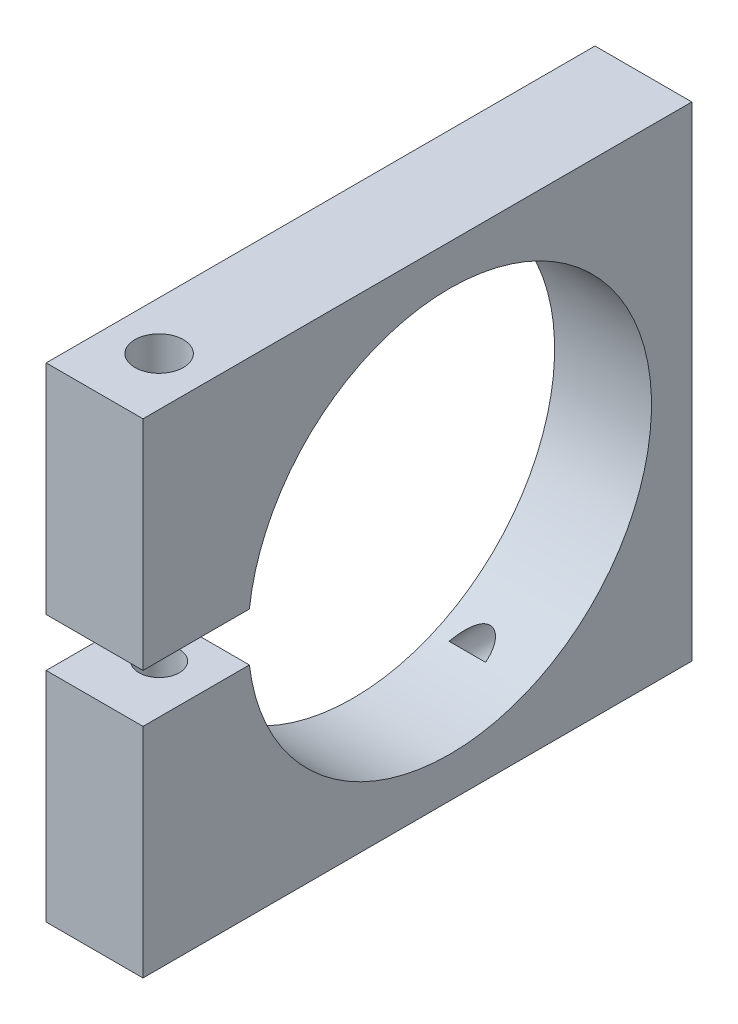
ISO-10303-21;
HEADER;
FILE_DESCRIPTION(('STEP AP214'),'2;1');
FILE_NAME('part.step','',(''),(''),'','','');
FILE_SCHEMA(('AUTOMOTIVE_DESIGN { 1 0 10303 214 1 1 1 1 }'));
ENDSEC;
DATA;
#1=APPLICATION_CONTEXT('core data for automotive mechanical design processes');
#2=APPLICATION_PROTOCOL_DEFINITION('international standard','automotive_design',2000,#1);
#3=PRODUCT_CONTEXT('',#1,'mechanical');
#4=PRODUCT('Part','Part','',(#3));
#5=PRODUCT_RELATED_PRODUCT_CATEGORY('part','',(#4));
#6=PRODUCT_DEFINITION_FORMATION('','',#4);
#7=PRODUCT_DEFINITION_CONTEXT('part definition',#1,'design');
#8=PRODUCT_DEFINITION('design','',#6,#7);
#9=PRODUCT_DEFINITION_SHAPE('','',#8);
#10=(LENGTH_UNIT() NAMED_UNIT(*) SI_UNIT(.MILLI.,.METRE.));
#11=(NAMED_UNIT(*) PLANE_ANGLE_UNIT() SI_UNIT($,.RADIAN.));
#12=(NAMED_UNIT(*) SI_UNIT($,.STERADIAN.) SOLID_ANGLE_UNIT());
#13=UNCERTAINTY_MEASURE_WITH_UNIT(LENGTH_MEASURE(1.E-05),#10,'distance_accuracy_value','');
#14=(GEOMETRIC_REPRESENTATION_CONTEXT(3) GLOBAL_UNCERTAINTY_ASSIGNED_CONTEXT((#13)) GLOBAL_UNIT_ASSIGNED_CONTEXT((#10,
#11,#12)) REPRESENTATION_CONTEXT('',''));
#15=CARTESIAN_POINT('',(0.,0.,0.));
#16=DIRECTION('',(0.,0.,1.));
#17=DIRECTION('',(1.,0.,0.));
#18=AXIS2_PLACEMENT_3D('',#15,#16,#17);
#19=CARTESIAN_POINT('',(276.,679.332012286218,-391.357743681072));
#20=DIRECTION('',(0.,0.,1.));
#21=DIRECTION('',(1.,0.,0.));
#22=AXIS2_PLACEMENT_3D('',#19,#20,#21);
#23=PLANE('',#22);
#24=DIRECTION('',(1.,0.,0.));
#25=VECTOR('',#24,1.);
#26=CARTESIAN_POINT('',(276.,678.788451523607,-391.357743681072));
#27=LINE('',#26,#25);
#28=CARTESIAN_POINT('',(277.125629467165,678.788451523608,-391.357743681072));
#29=VERTEX_POINT('',#28);
#30=CARTESIAN_POINT('',(274.874370532835,678.788451523608,-391.357743681072));
#31=VERTEX_POINT('',#30);
#32=EDGE_CURVE('E91',#29,#31,#27,.F.);
#33=ORIENTED_EDGE('',*,*,#32,.T.);
#34=CARTESIAN_POINT('',(276.,679.332012286218,-391.357743681072));
#35=DIRECTION('',(0.,0.,1.));
#36=DIRECTION('',(1.,0.,0.));
#37=AXIS2_PLACEMENT_3D('',#34,#35,#36);
#38=CIRCLE('',#37,1.25);
#39=EDGE_CURVE('E20',#31,#29,#38,.F.);
#40=ORIENTED_EDGE('',*,*,#39,.T.);
#41=EDGE_LOOP('',(#33,#40));
#42=FACE_BOUND('',#41,.T.);
#43=ADVANCED_FACE('F17',(#42),#23,.F.);
#44=CARTESIAN_POINT('',(275.09203088991,655.349193600852,-391.357743681072));
#45=DIRECTION('',(0.,0.,1.));
#46=DIRECTION('',(1.,0.,0.));
#47=AXIS2_PLACEMENT_3D('',#44,#45,#46);
#48=PLANE('',#47);
#49=CARTESIAN_POINT('',(275.09203088991,655.349193600852,-391.357743681072));
#50=DIRECTION('',(0.,0.,1.));
#51=DIRECTION('',(1.,0.,0.));
#52=AXIS2_PLACEMENT_3D('',#49,#50,#51);
#53=CIRCLE('',#52,1.25);
#54=CARTESIAN_POINT('',(276.225796596195,655.875573048828,-391.357743681072));
#55=VERTEX_POINT('',#54);
#56=CARTESIAN_POINT('',(273.958265183625,655.875573048828,-391.357743681072));
#57=VERTEX_POINT('',#56);
#58=EDGE_CURVE('E100',#55,#57,#53,.F.);
#59=ORIENTED_EDGE('',*,*,#58,.T.);
#60=DIRECTION('',(1.,0.,0.));
#61=VECTOR('',#60,1.);
#62=CARTESIAN_POINT('',(276.,655.875573048828,-391.357743681072));
#63=LINE('',#62,#61);
#64=EDGE_CURVE('E103',#57,#55,#63,.T.);
#65=ORIENTED_EDGE('',*,*,#64,.T.);
#66=EDGE_LOOP('',(#59,#65));
#67=FACE_BOUND('',#66,.T.);
#68=ADVANCED_FACE('F317',(#67),#48,.F.);
#69=CARTESIAN_POINT('',(276.,675.582012286218,-371.357743681072));
#70=DIRECTION('',(0.,-1.,0.));
#71=DIRECTION('',(1.,0.,0.));
#72=AXIS2_PLACEMENT_3D('',#69,#70,#71);
#73=CYLINDRICAL_SURFACE('',#72,1.5);
#74=CARTESIAN_POINT('',(276.,668.832012286218,-371.357743681072));
#75=DIRECTION('',(0.,-1.,0.));
#76=DIRECTION('',(1.,0.,0.));
#77=AXIS2_PLACEMENT_3D('',#74,#75,#76);
#78=CIRCLE('',#77,1.5);
#79=CARTESIAN_POINT('',(277.5,668.832012286218,-371.357743681072));
#80=VERTEX_POINT('',#79);
#81=EDGE_CURVE('E144',#80,#80,#78,.F.);
#82=ORIENTED_EDGE('',*,*,#81,.F.);
#83=EDGE_LOOP('',(#82));
#84=FACE_BOUND('',#83,.T.);
#85=CARTESIAN_POINT('',(276.,682.332012286218,-371.357743681072));
#86=DIRECTION('',(0.,-1.,0.));
#87=DIRECTION('',(1.,0.,0.));
#88=AXIS2_PLACEMENT_3D('',#85,#86,#87);
#89=CIRCLE('',#88,1.5);
#90=CARTESIAN_POINT('',(277.5,682.332012286218,-371.357743681072));
#91=VERTEX_POINT('',#90);
#92=EDGE_CURVE('E166',#91,#91,#89,.F.);
#93=ORIENTED_EDGE('',*,*,#92,.T.);
#94=EDGE_LOOP('',(#93));
#95=FACE_BOUND('',#94,.T.);
#96=ADVANCED_FACE('F314',(#84,#95),#73,.F.);
#97=CARTESIAN_POINT('',(276.,679.332012286218,-396.357743681072));
#98=DIRECTION('',(0.,0.,1.));
#99=DIRECTION('',(1.,0.,0.));
#100=AXIS2_PLACEMENT_3D('',#97,#98,#99);
#101=CYLINDRICAL_SURFACE('',#100,1.25);
#102=ORIENTED_EDGE('',*,*,#39,.F.);
#103=CARTESIAN_POINT('',(274.874370532835,678.788451523607,-391.357743681072));
#104=CARTESIAN_POINT('',(274.888547311662,678.759158530851,-391.424874986713));
#105=CARTESIAN_POINT('',(274.904313848297,678.729372421661,-391.491501734669));
#106=CARTESIAN_POINT('',(274.9397679739,678.668944062371,-391.623599616107));
#107=CARTESIAN_POINT('',(274.959469099715,678.638299179585,-391.689065886078));
#108=CARTESIAN_POINT('',(275.003676057281,678.576166002763,-391.81890168151));
#109=CARTESIAN_POINT('',(275.028230354256,678.544672223009,-391.883252367618));
#110=CARTESIAN_POINT('',(275.082904318561,678.481613735001,-392.009411103043));
#111=CARTESIAN_POINT('',(275.113015326515,678.450049211576,-392.07122292807));
#112=CARTESIAN_POINT('',(275.176377528957,678.390833126092,-392.184933084611));
#113=CARTESIAN_POINT('',(275.208939854464,678.363126685746,-392.237181628786));
#114=CARTESIAN_POINT('',(275.280483611646,678.308874158125,-392.337858019734));
#115=CARTESIAN_POINT('',(275.319466449945,678.282328326737,-392.386285025827));
#116=CARTESIAN_POINT('',(275.405645974502,678.231193381973,-392.478254782907));
#117=CARTESIAN_POINT('',(275.452962380708,678.206641680737,-392.521708573744));
#118=CARTESIAN_POINT('',(275.556312758383,678.162069280487,-392.599688219837));
#119=CARTESIAN_POINT('',(275.612305184547,678.142028049982,-392.634254636942));
#120=CARTESIAN_POINT('',(275.706730571812,678.116379441297,-392.678169033972));
#121=CARTESIAN_POINT('',(275.742413610677,678.108266366053,-392.691977271443));
#122=CARTESIAN_POINT('',(275.815898753795,678.09508511055,-392.714349171645));
#123=CARTESIAN_POINT('',(275.853695430248,678.090009490308,-392.722925650124));
#124=CARTESIAN_POINT('',(275.90986700991,678.085136691964,-392.731151203177));
#125=CARTESIAN_POINT('',(275.927811806635,678.083968334202,-392.733121607686));
#126=CARTESIAN_POINT('',(275.963834554638,678.082405444177,-392.735756622392));
#127=CARTESIAN_POINT('',(275.981912534552,678.082011083516,-392.736420943019));
#128=CARTESIAN_POINT('',(276.037919978754,678.082014807657,-392.736415211869));
#129=CARTESIAN_POINT('',(276.075881648531,678.083755917596,-392.733483360501));
#130=CARTESIAN_POINT('',(276.1506640448,678.090554399809,-392.722004282596));
#131=CARTESIAN_POINT('',(276.187482616641,678.095617678574,-392.713447054638));
#132=CARTESIAN_POINT('',(276.258799309285,678.108562896897,-392.691472107619));
#133=CARTESIAN_POINT('',(276.293311748135,678.116425051147,-392.678088497932));
#134=CARTESIAN_POINT('',(276.359808003671,678.134420168054,-392.64728285928));
#135=CARTESIAN_POINT('',(276.391791566937,678.144553357903,-392.629860426269));
#136=CARTESIAN_POINT('',(276.473431946554,678.17386746781,-392.579118213456));
#137=CARTESIAN_POINT('',(276.52074143226,678.194591782749,-392.542918519009));
#138=CARTESIAN_POINT('',(276.608389782036,678.238947914011,-392.464363314685));
#139=CARTESIAN_POINT('',(276.648706863418,678.26258843691,-392.421989299127));
#140=CARTESIAN_POINT('',(276.717943107232,678.308039807981,-392.339275940135));
#141=CARTESIAN_POINT('',(276.747667781704,678.329642601314,-392.299484027972));
#142=CARTESIAN_POINT('',(276.803143848716,678.373519078256,-392.217547113976));
#143=CARTESIAN_POINT('',(276.828892068646,678.395793280787,-392.175400269396));
#144=CARTESIAN_POINT('',(276.901096409584,678.463167645459,-392.046047910081));
#145=CARTESIAN_POINT('',(276.942337299412,678.50869602627,-391.956153765723));
#146=CARTESIAN_POINT('',(277.010295021336,678.594152717142,-391.782004780799));
#147=CARTESIAN_POINT('',(277.038098936915,678.634155153897,-391.69818824205));
#148=CARTESIAN_POINT('',(277.074585053104,678.693036947295,-391.571117453222));
#149=CARTESIAN_POINT('',(277.085826066564,678.712366875094,-391.528788775998));
#150=CARTESIAN_POINT('',(277.106809552187,678.750679327403,-391.443628570796));
#151=CARTESIAN_POINT('',(277.116552682619,678.769662001269,-391.400797272662));
#152=CARTESIAN_POINT('',(277.125629467165,678.788451523607,-391.357743681072));
#153=B_SPLINE_CURVE_WITH_KNOTS('',3,(#103,#104,#105,#106,#107,#108,#109,#110,#111,#112,#113,
#114,#115,#116,#117,#118,#119,#120,#121,#122,#123,#124,#125,#126,#127,#128,#129,#130,#131,#132,
#133,#134,#135,#136,#137,#138,#139,#140,#141,#142,#143,#144,#145,#146,#147,#148,#149,#150,#151,
#152),.UNSPECIFIED.,.F.,.F.,(4,2,2,2,2,2,2,2,2,2,2,2,2,2,2,2,2,2,2,2,2,2,2,2,4),(0.,
0.223852835243964,0.448489525676321,0.675494513856815,0.902148688066082,1.10435915089784,
1.30661397366381,1.51205494754333,1.71654094559981,1.83345002557234,1.95007156215759,
2.00428725628167,2.05851496910071,2.17220219210391,2.28609208955678,2.39919238207929,
2.51230399409326,2.70043472714962,2.88914138900703,3.05139545995385,3.2137783236471,
3.53946222024909,3.83000013337773,3.97359127374062,4.11711912909475),.UNSPECIFIED.);
#154=EDGE_CURVE('E98',#31,#29,#153,.T.);
#155=ORIENTED_EDGE('',*,*,#154,.T.);
#156=EDGE_LOOP('',(#102,#155));
#157=FACE_BOUND('',#156,.T.);
#158=CARTESIAN_POINT('',(276.,679.332012286218,-401.357743681072));
#159=DIRECTION('',(0.,0.,1.));
#160=DIRECTION('',(1.,0.,0.));
#161=AXIS2_PLACEMENT_3D('',#158,#159,#160);
#162=CIRCLE('',#161,1.25);
#163=CARTESIAN_POINT('',(277.25,679.332012286218,-401.357743681072));
#164=VERTEX_POINT('',#163);
#165=EDGE_CURVE('E131',#164,#164,#162,.F.);
#166=ORIENTED_EDGE('',*,*,#165,.T.);
#167=EDGE_LOOP('',(#166));
#168=FACE_BOUND('',#167,.T.);
#169=ADVANCED_FACE('F96',(#157,#168),#101,.F.);
#170=CARTESIAN_POINT('',(275.09203088991,655.349193600852,-396.357743681072));
#171=DIRECTION('',(0.,0.,1.));
#172=DIRECTION('',(1.,0.,0.));
#173=AXIS2_PLACEMENT_3D('',#170,#171,#172);
#174=CYLINDRICAL_SURFACE('',#173,1.25);
#175=ORIENTED_EDGE('',*,*,#58,.F.);
#176=CARTESIAN_POINT('',(276.225796596195,655.875573048828,-391.357743681072));
#177=CARTESIAN_POINT('',(276.211912813258,655.905408764792,-391.426118824964));
#178=CARTESIAN_POINT('',(276.19641597643,655.935763137653,-391.493987142951));
#179=CARTESIAN_POINT('',(276.161439417601,655.997379700106,-391.628565866877));
#180=CARTESIAN_POINT('',(276.141945940009,656.028644696172,-391.69527138649));
#181=CARTESIAN_POINT('',(276.098079753026,656.092068931824,-391.827580703306));
#182=CARTESIAN_POINT('',(276.073658397096,656.124234090516,-391.893165821639));
#183=CARTESIAN_POINT('',(276.019147353394,656.188679805774,-392.021779187281));
#184=CARTESIAN_POINT('',(275.989066491429,656.220960106899,-392.084811232477));
#185=CARTESIAN_POINT('',(275.92576068952,656.281444251563,-392.200578846786));
#186=CARTESIAN_POINT('',(275.893261425385,656.309700942321,-392.253678407755));
#187=CARTESIAN_POINT('',(275.821762767232,656.365085533453,-392.35606840696));
#188=CARTESIAN_POINT('',(275.782761699795,656.392213140974,-392.405357859766));
#189=CARTESIAN_POINT('',(275.696439599449,656.444541318179,-392.499070386438));
#190=CARTESIAN_POINT('',(275.648998032922,656.469705133101,-392.543405339136));
#191=CARTESIAN_POINT('',(275.545230227124,656.515506068184,-392.623148278188));
#192=CARTESIAN_POINT('',(275.488946417484,656.536163734838,-392.658596898557));
#193=CARTESIAN_POINT('',(275.39402863583,656.562691833257,-392.703774571339));
#194=CARTESIAN_POINT('',(275.358241131438,656.571098349421,-392.718004066657));
#195=CARTESIAN_POINT('',(275.28446946044,656.584857023709,-392.741225264732));
#196=CARTESIAN_POINT('',(275.246490740355,656.590216423643,-392.750229387232));
#197=CARTESIAN_POINT('',(275.188807203642,656.595590549123,-392.759248121985));
#198=CARTESIAN_POINT('',(275.169551760163,656.596937580101,-392.761506200024));
#199=CARTESIAN_POINT('',(275.130877922597,656.598739855288,-392.764526474793));
#200=CARTESIAN_POINT('',(275.11145949315,656.599194900687,-392.765288338038));
#201=CARTESIAN_POINT('',(275.053952781713,656.599191053305,-392.765282456632));
#202=CARTESIAN_POINT('',(275.01583559388,656.597435589829,-392.762344456205));
#203=CARTESIAN_POINT('',(274.940748346093,656.590580872133,-392.750840965678));
#204=CARTESIAN_POINT('',(274.903780322562,656.585476000942,-392.742266022354));
#205=CARTESIAN_POINT('',(274.832171563862,656.572422853354,-392.720242820909));
#206=CARTESIAN_POINT('',(274.797516579527,656.564494360849,-392.706828462186));
#207=CARTESIAN_POINT('',(274.730745463255,656.546345266518,-392.675948220418));
#208=CARTESIAN_POINT('',(274.698629652353,656.536124375483,-392.658481826159));
#209=CARTESIAN_POINT('',(274.616730699125,656.5065809159,-392.607653095011));
#210=CARTESIAN_POINT('',(274.569296108306,656.485706897347,-392.571413403411));
#211=CARTESIAN_POINT('',(274.481421399781,656.441027414135,-392.492766690766));
#212=CARTESIAN_POINT('',(274.441002877616,656.417213271627,-392.450341342547));
#213=CARTESIAN_POINT('',(274.371669416427,656.37146877818,-392.367601976533));
#214=CARTESIAN_POINT('',(274.341935967918,656.349751070698,-392.327843519814));
#215=CARTESIAN_POINT('',(274.286445499192,656.305638625225,-392.245973863276));
#216=CARTESIAN_POINT('',(274.260691632952,656.283243366886,-392.203860832995));
#217=CARTESIAN_POINT('',(274.188472087447,656.215490945097,-392.074595294413));
#218=CARTESIAN_POINT('',(274.147233120059,656.169698171114,-391.98475164175));
#219=CARTESIAN_POINT('',(274.07752013815,656.081468303455,-391.806105751061));
#220=CARTESIAN_POINT('',(274.048443182376,656.038990947805,-391.717546878827));
#221=CARTESIAN_POINT('',(274.010595901181,655.976551287971,-391.583249074795));
#222=CARTESIAN_POINT('',(273.998996144469,655.956074291252,-391.53852252198));
#223=CARTESIAN_POINT('',(273.977443911473,655.915516356756,-391.448525373925));
#224=CARTESIAN_POINT('',(273.967490563033,655.89543521428,-391.403255080442));
#225=CARTESIAN_POINT('',(273.958265183625,655.875573048828,-391.357743681072));
#226=B_SPLINE_CURVE_WITH_KNOTS('',3,(#176,#177,#178,#179,#180,#181,#182,#183,#184,#185,#186,
#187,#188,#189,#190,#191,#192,#193,#194,#195,#196,#197,#198,#199,#200,#201,#202,#203,#204,#205,
#206,#207,#208,#209,#210,#211,#212,#213,#214,#215,#216,#217,#218,#219,#220,#221,#222,#223,#224,
#225),.UNSPECIFIED.,.F.,.F.,(4,2,2,2,2,2,2,2,2,2,2,2,2,2,2,2,2,2,2,2,2,2,2,2,4),(0.,
0.227689463136876,0.456176152549546,0.687039662433459,0.917546088668923,1.12232442490628,
1.32715554809219,1.53518877012573,1.74225262794148,1.86008396629231,1.97763408205646,
2.03586724255388,2.09411338088751,2.2082699535497,2.32261845828007,2.43618104480827,
2.54975796643882,2.73838441850979,2.92758154860538,3.0899144897238,3.25237543350026,
3.57826663381338,3.88520294132584,4.03679663083097,4.18830975723184),.UNSPECIFIED.);
#227=EDGE_CURVE('E150',#55,#57,#226,.T.);
#228=ORIENTED_EDGE('',*,*,#227,.T.);
#229=EDGE_LOOP('',(#175,#228));
#230=FACE_BOUND('',#229,.T.);
#231=CARTESIAN_POINT('',(275.09203088991,655.349193600852,-401.357743681072));
#232=DIRECTION('',(0.,0.,1.));
#233=DIRECTION('',(1.,0.,0.));
#234=AXIS2_PLACEMENT_3D('',#231,#232,#233);
#235=CIRCLE('',#234,1.25);
#236=CARTESIAN_POINT('',(276.34203088991,655.349193600852,-401.357743681072));
#237=VERTEX_POINT('',#236);
#238=EDGE_CURVE('E161',#237,#237,#235,.F.);
#239=ORIENTED_EDGE('',*,*,#238,.T.);
#240=EDGE_LOOP('',(#239));
#241=FACE_BOUND('',#240,.T.);
#242=ADVANCED_FACE('F183',(#230,#241),#174,.F.);
#243=CARTESIAN_POINT('',(273.,652.332012286218,-367.357743681072));
#244=DIRECTION('',(-1.,0.,0.));
#245=DIRECTION('',(0.,0.,1.));
#246=AXIS2_PLACEMENT_3D('',#243,#244,#245);
#247=PLANE('',#246);
#248=DIRECTION('',(0.,0.,1.));
#249=VECTOR('',#248,1.);
#250=CARTESIAN_POINT('',(273.,652.332012286218,-367.357743681072));
#251=LINE('',#250,#249);
#252=CARTESIAN_POINT('',(273.,652.332012286218,-401.357743681072));
#253=VERTEX_POINT('',#252);
#254=CARTESIAN_POINT('',(273.,652.332012286218,-367.357743681072));
#255=VERTEX_POINT('',#254);
#256=EDGE_CURVE('E123',#253,#255,#251,.T.);
#257=ORIENTED_EDGE('',*,*,#256,.T.);
#258=DIRECTION('',(0.,1.,0.));
#259=VECTOR('',#258,1.);
#260=CARTESIAN_POINT('',(273.,665.832012286218,-367.357743681072));
#261=LINE('',#260,#259);
#262=CARTESIAN_POINT('',(273.,665.832012286218,-367.357743681072));
#263=VERTEX_POINT('',#262);
#264=EDGE_CURVE('E118',#255,#263,#261,.T.);
#265=ORIENTED_EDGE('',*,*,#264,.T.);
#266=DIRECTION('',(0.,0.,1.));
#267=VECTOR('',#266,1.);
#268=CARTESIAN_POINT('',(273.,665.832012286218,-369.857743681072));
#269=LINE('',#268,#267);
#270=CARTESIAN_POINT('',(273.,665.832012286218,-373.948070035081));
#271=VERTEX_POINT('',#270);
#272=EDGE_CURVE('E112',#271,#263,#269,.T.);
#273=ORIENTED_EDGE('',*,*,#272,.F.);
#274=CARTESIAN_POINT('',(273.,667.332012286218,-386.357743681072));
#275=DIRECTION('',(1.,0.,0.));
#276=DIRECTION('',(0.,0.,-1.));
#277=AXIS2_PLACEMENT_3D('',#274,#275,#276);
#278=CIRCLE('',#277,12.5);
#279=CARTESIAN_POINT('',(273.,668.832012286218,-373.948070035081));
#280=VERTEX_POINT('',#279);
#281=EDGE_CURVE('E105',#271,#280,#278,.T.);
#282=ORIENTED_EDGE('',*,*,#281,.T.);
#283=DIRECTION('',(0.,0.,-1.));
#284=VECTOR('',#283,1.);
#285=CARTESIAN_POINT('',(273.,668.832012286218,-369.857743681072));
#286=LINE('',#285,#284);
#287=CARTESIAN_POINT('',(273.,668.832012286218,-367.357743681072));
#288=VERTEX_POINT('',#287);
#289=EDGE_CURVE('E147',#288,#280,#286,.T.);
#290=ORIENTED_EDGE('',*,*,#289,.F.);
#291=DIRECTION('',(0.,1.,0.));
#292=VECTOR('',#291,1.);
#293=CARTESIAN_POINT('',(273.,682.332012286218,-367.357743681072));
#294=LINE('',#293,#292);
#295=CARTESIAN_POINT('',(273.,682.332012286218,-367.357743681072));
#296=VERTEX_POINT('',#295);
#297=EDGE_CURVE('E141',#288,#296,#294,.T.);
#298=ORIENTED_EDGE('',*,*,#297,.T.);
#299=DIRECTION('',(0.,0.,-1.));
#300=VECTOR('',#299,1.);
#301=CARTESIAN_POINT('',(273.,682.332012286218,-367.357743681072));
#302=LINE('',#301,#300);
#303=CARTESIAN_POINT('',(273.,682.332012286218,-401.357743681072));
#304=VERTEX_POINT('',#303);
#305=EDGE_CURVE('E135',#296,#304,#302,.T.);
#306=ORIENTED_EDGE('',*,*,#305,.T.);
#307=DIRECTION('',(0.,1.,0.));
#308=VECTOR('',#307,1.);
#309=CARTESIAN_POINT('',(273.,682.332012286218,-401.357743681072));
#310=LINE('',#309,#308);
#311=EDGE_CURVE('E129',#304,#253,#310,.F.);
#312=ORIENTED_EDGE('',*,*,#311,.T.);
#313=EDGE_LOOP('',(#257,#265,#273,#282,#290,#298,#306,#312));
#314=FACE_BOUND('',#313,.T.);
#315=ADVANCED_FACE('F196',(#314),#247,.T.);
#316=CARTESIAN_POINT('',(276.,667.332012286218,-371.357743681072));
#317=DIRECTION('',(0.,1.,0.));
#318=DIRECTION('',(-1.,0.,0.));
#319=AXIS2_PLACEMENT_3D('',#316,#317,#318);
#320=CYLINDRICAL_SURFACE('',#319,1.25);
#321=CARTESIAN_POINT('',(276.,665.832012286218,-371.357743681072));
#322=DIRECTION('',(0.,1.,0.));
#323=DIRECTION('',(-1.,0.,0.));
#324=AXIS2_PLACEMENT_3D('',#321,#322,#323);
#325=CIRCLE('',#324,1.25);
#326=CARTESIAN_POINT('',(274.75,665.832012286218,-371.357743681072));
#327=VERTEX_POINT('',#326);
#328=EDGE_CURVE('E114',#327,#327,#325,.F.);
#329=ORIENTED_EDGE('',*,*,#328,.F.);
#330=EDGE_LOOP('',(#329));
#331=FACE_BOUND('',#330,.T.);
#332=CARTESIAN_POINT('',(276.,652.332012286218,-371.357743681072));
#333=DIRECTION('',(0.,1.,0.));
#334=DIRECTION('',(-1.,0.,0.));
#335=AXIS2_PLACEMENT_3D('',#332,#333,#334);
#336=CIRCLE('',#335,1.25);
#337=CARTESIAN_POINT('',(274.75,652.332012286218,-371.357743681072));
#338=VERTEX_POINT('',#337);
#339=EDGE_CURVE('E125',#338,#338,#336,.F.);
#340=ORIENTED_EDGE('',*,*,#339,.T.);
#341=EDGE_LOOP('',(#340));
#342=FACE_BOUND('',#341,.T.);
#343=ADVANCED_FACE('F191',(#331,#342),#320,.F.);
#344=CARTESIAN_POINT('',(276.,667.332012286218,-386.357743681072));
#345=DIRECTION('',(1.,0.,0.));
#346=DIRECTION('',(0.,0.,-1.));
#347=AXIS2_PLACEMENT_3D('',#344,#345,#346);
#348=CYLINDRICAL_SURFACE('',#347,12.5);
#349=ORIENTED_EDGE('',*,*,#227,.F.);
#350=ORIENTED_EDGE('',*,*,#64,.F.);
#351=EDGE_LOOP('',(#349,#350));
#352=FACE_BOUND('',#351,.T.);
#353=ORIENTED_EDGE('',*,*,#154,.F.);
#354=ORIENTED_EDGE('',*,*,#32,.F.);
#355=EDGE_LOOP('',(#353,#354));
#356=FACE_BOUND('',#355,.T.);
#357=CARTESIAN_POINT('',(279.,667.332012286218,-386.357743681072));
#358=DIRECTION('',(1.,0.,0.));
#359=DIRECTION('',(0.,0.,-1.));
#360=AXIS2_PLACEMENT_3D('',#357,#358,#359);
#361=CIRCLE('',#360,12.5);
#362=CARTESIAN_POINT('',(279.,665.832012286218,-373.948070035081));
#363=VERTEX_POINT('',#362);
#364=CARTESIAN_POINT('',(279.,668.832012286218,-373.948070035081));
#365=VERTEX_POINT('',#364);
#366=EDGE_CURVE('E153',#363,#365,#361,.T.);
#367=ORIENTED_EDGE('',*,*,#366,.T.);
#368=DIRECTION('',(1.,0.,0.));
#369=VECTOR('',#368,1.);
#370=CARTESIAN_POINT('',(276.,668.832012286218,-373.948070035081));
#371=LINE('',#370,#369);
#372=EDGE_CURVE('E149',#280,#365,#371,.T.);
#373=ORIENTED_EDGE('',*,*,#372,.F.);
#374=ORIENTED_EDGE('',*,*,#281,.F.);
#375=DIRECTION('',(1.,0.,0.));
#376=VECTOR('',#375,1.);
#377=CARTESIAN_POINT('',(276.,665.832012286218,-373.948070035081));
#378=LINE('',#377,#376);
#379=EDGE_CURVE('E115',#363,#271,#378,.F.);
#380=ORIENTED_EDGE('',*,*,#379,.F.);
#381=EDGE_LOOP('',(#367,#373,#374,#380));
#382=FACE_BOUND('',#381,.T.);
#383=ADVANCED_FACE('F101',(#352,#356,#382),#348,.F.);
#384=CARTESIAN_POINT('',(276.,668.832012286218,-369.857743681072));
#385=DIRECTION('',(0.,-1.,0.));
#386=DIRECTION('',(0.,0.,-1.));
#387=AXIS2_PLACEMENT_3D('',#384,#385,#386);
#388=PLANE('',#387);
#389=ORIENTED_EDGE('',*,*,#81,.T.);
#390=EDGE_LOOP('',(#389));
#391=FACE_BOUND('',#390,.T.);
#392=ORIENTED_EDGE('',*,*,#372,.T.);
#393=DIRECTION('',(0.,0.,1.));
#394=VECTOR('',#393,1.);
#395=CARTESIAN_POINT('',(279.,668.832012286218,-367.357743681072));
#396=LINE('',#395,#394);
#397=CARTESIAN_POINT('',(279.,668.832012286218,-367.357743681072));
#398=VERTEX_POINT('',#397);
#399=EDGE_CURVE('E156',#365,#398,#396,.T.);
#400=ORIENTED_EDGE('',*,*,#399,.T.);
#401=DIRECTION('',(-1.,0.,0.));
#402=VECTOR('',#401,1.);
#403=CARTESIAN_POINT('',(273.,668.832012286218,-367.357743681072));
#404=LINE('',#403,#402);
#405=EDGE_CURVE('E138',#398,#288,#404,.T.);
#406=ORIENTED_EDGE('',*,*,#405,.T.);
#407=ORIENTED_EDGE('',*,*,#289,.T.);
#408=EDGE_LOOP('',(#392,#400,#406,#407));
#409=FACE_BOUND('',#408,.T.);
#410=ADVANCED_FACE('F190',(#391,#409),#388,.T.);
#411=CARTESIAN_POINT('',(273.,682.332012286218,-367.357743681072));
#412=DIRECTION('',(0.,0.,-1.));
#413=DIRECTION('',(-1.,0.,0.));
#414=AXIS2_PLACEMENT_3D('',#411,#412,#413);
#415=PLANE('',#414);
#416=DIRECTION('',(0.,1.,0.));
#417=VECTOR('',#416,1.);
#418=CARTESIAN_POINT('',(279.,652.332012286218,-367.357743681072));
#419=LINE('',#418,#417);
#420=CARTESIAN_POINT('',(279.,682.332012286218,-367.357743681072));
#421=VERTEX_POINT('',#420);
#422=EDGE_CURVE('E242',#398,#421,#419,.T.);
#423=ORIENTED_EDGE('',*,*,#422,.T.);
#424=DIRECTION('',(1.,0.,0.));
#425=VECTOR('',#424,1.);
#426=CARTESIAN_POINT('',(279.,682.332012286218,-367.357743681072));
#427=LINE('',#426,#425);
#428=EDGE_CURVE('E137',#421,#296,#427,.F.);
#429=ORIENTED_EDGE('',*,*,#428,.T.);
#430=ORIENTED_EDGE('',*,*,#297,.F.);
#431=ORIENTED_EDGE('',*,*,#405,.F.);
#432=EDGE_LOOP('',(#423,#429,#430,#431));
#433=FACE_BOUND('',#432,.T.);
#434=ADVANCED_FACE('F231',(#433),#415,.F.);
#435=CARTESIAN_POINT('',(279.,682.332012286218,-367.357743681072));
#436=DIRECTION('',(0.,-1.,0.));
#437=DIRECTION('',(0.,0.,-1.));
#438=AXIS2_PLACEMENT_3D('',#435,#436,#437);
#439=PLANE('',#438);
#440=ORIENTED_EDGE('',*,*,#92,.F.);
#441=EDGE_LOOP('',(#440));
#442=FACE_BOUND('',#441,.T.);
#443=DIRECTION('',(0.,0.,1.));
#444=VECTOR('',#443,1.);
#445=CARTESIAN_POINT('',(279.,682.332012286218,-367.357743681072));
#446=LINE('',#445,#444);
#447=CARTESIAN_POINT('',(279.,682.332012286218,-401.357743681072));
#448=VERTEX_POINT('',#447);
#449=EDGE_CURVE('E247',#421,#448,#446,.F.);
#450=ORIENTED_EDGE('',*,*,#449,.T.);
#451=DIRECTION('',(1.,0.,0.));
#452=VECTOR('',#451,1.);
#453=CARTESIAN_POINT('',(279.,682.332012286218,-401.357743681072));
#454=LINE('',#453,#452);
#455=EDGE_CURVE('E132',#448,#304,#454,.F.);
#456=ORIENTED_EDGE('',*,*,#455,.T.);
#457=ORIENTED_EDGE('',*,*,#305,.F.);
#458=ORIENTED_EDGE('',*,*,#428,.F.);
#459=EDGE_LOOP('',(#450,#456,#457,#458));
#460=FACE_BOUND('',#459,.T.);
#461=ADVANCED_FACE('F228',(#442,#460),#439,.F.);
#462=CARTESIAN_POINT('',(279.,682.332012286218,-401.357743681072));
#463=DIRECTION('',(0.,0.,1.));
#464=DIRECTION('',(1.,0.,0.));
#465=AXIS2_PLACEMENT_3D('',#462,#463,#464);
#466=PLANE('',#465);
#467=ORIENTED_EDGE('',*,*,#238,.F.);
#468=EDGE_LOOP('',(#467));
#469=FACE_BOUND('',#468,.T.);
#470=ORIENTED_EDGE('',*,*,#165,.F.);
#471=EDGE_LOOP('',(#470));
#472=FACE_BOUND('',#471,.T.);
#473=ORIENTED_EDGE('',*,*,#311,.F.);
#474=ORIENTED_EDGE('',*,*,#455,.F.);
#475=DIRECTION('',(0.,1.,0.));
#476=VECTOR('',#475,1.);
#477=CARTESIAN_POINT('',(279.,652.332012286218,-401.357743681072));
#478=LINE('',#477,#476);
#479=CARTESIAN_POINT('',(279.,652.332012286218,-401.357743681072));
#480=VERTEX_POINT('',#479);
#481=EDGE_CURVE('E250',#448,#480,#478,.F.);
#482=ORIENTED_EDGE('',*,*,#481,.T.);
#483=DIRECTION('',(1.,0.,0.));
#484=VECTOR('',#483,1.);
#485=CARTESIAN_POINT('',(273.,652.332012286218,-401.357743681072));
#486=LINE('',#485,#484);
#487=EDGE_CURVE('E126',#480,#253,#486,.F.);
#488=ORIENTED_EDGE('',*,*,#487,.T.);
#489=EDGE_LOOP('',(#473,#474,#482,#488));
#490=FACE_BOUND('',#489,.T.);
#491=ADVANCED_FACE('F224',(#469,#472,#490),#466,.F.);
#492=CARTESIAN_POINT('',(273.,652.332012286218,-367.357743681072));
#493=DIRECTION('',(0.,1.,0.));
#494=DIRECTION('',(0.,0.,1.));
#495=AXIS2_PLACEMENT_3D('',#492,#493,#494);
#496=PLANE('',#495);
#497=ORIENTED_EDGE('',*,*,#339,.F.);
#498=EDGE_LOOP('',(#497));
#499=FACE_BOUND('',#498,.T.);
#500=ORIENTED_EDGE('',*,*,#256,.F.);
#501=ORIENTED_EDGE('',*,*,#487,.F.);
#502=DIRECTION('',(0.,0.,1.));
#503=VECTOR('',#502,1.);
#504=CARTESIAN_POINT('',(279.,652.332012286218,-367.357743681072));
#505=LINE('',#504,#503);
#506=CARTESIAN_POINT('',(279.,652.332012286218,-367.357743681072));
#507=VERTEX_POINT('',#506);
#508=EDGE_CURVE('E273',#480,#507,#505,.T.);
#509=ORIENTED_EDGE('',*,*,#508,.T.);
#510=DIRECTION('',(-1.,0.,0.));
#511=VECTOR('',#510,1.);
#512=CARTESIAN_POINT('',(273.,652.332012286218,-367.357743681072));
#513=LINE('',#512,#511);
#514=EDGE_CURVE('E120',#507,#255,#513,.T.);
#515=ORIENTED_EDGE('',*,*,#514,.T.);
#516=EDGE_LOOP('',(#500,#501,#509,#515));
#517=FACE_BOUND('',#516,.T.);
#518=ADVANCED_FACE('F220',(#499,#517),#496,.F.);
#519=CARTESIAN_POINT('',(273.,665.832012286218,-367.357743681072));
#520=DIRECTION('',(0.,0.,-1.));
#521=DIRECTION('',(-1.,0.,0.));
#522=AXIS2_PLACEMENT_3D('',#519,#520,#521);
#523=PLANE('',#522);
#524=ORIENTED_EDGE('',*,*,#264,.F.);
#525=ORIENTED_EDGE('',*,*,#514,.F.);
#526=DIRECTION('',(0.,1.,0.));
#527=VECTOR('',#526,1.);
#528=CARTESIAN_POINT('',(279.,652.332012286218,-367.357743681072));
#529=LINE('',#528,#527);
#530=CARTESIAN_POINT('',(279.,665.832012286218,-367.357743681072));
#531=VERTEX_POINT('',#530);
#532=EDGE_CURVE('E26',#507,#531,#529,.T.);
#533=ORIENTED_EDGE('',*,*,#532,.T.);
#534=DIRECTION('',(1.,0.,0.));
#535=VECTOR('',#534,1.);
#536=CARTESIAN_POINT('',(276.,665.832012286218,-367.357743681072));
#537=LINE('',#536,#535);
#538=EDGE_CURVE('E34',#263,#531,#537,.T.);
#539=ORIENTED_EDGE('',*,*,#538,.F.);
#540=EDGE_LOOP('',(#524,#525,#533,#539));
#541=FACE_BOUND('',#540,.T.);
#542=ADVANCED_FACE('F213',(#541),#523,.F.);
#543=CARTESIAN_POINT('',(276.,665.832012286218,-369.857743681072));
#544=DIRECTION('',(0.,1.,0.));
#545=DIRECTION('',(0.,0.,1.));
#546=AXIS2_PLACEMENT_3D('',#543,#544,#545);
#547=PLANE('',#546);
#548=ORIENTED_EDGE('',*,*,#328,.T.);
#549=EDGE_LOOP('',(#548));
#550=FACE_BOUND('',#549,.T.);
#551=ORIENTED_EDGE('',*,*,#379,.T.);
#552=ORIENTED_EDGE('',*,*,#272,.T.);
#553=ORIENTED_EDGE('',*,*,#538,.T.);
#554=DIRECTION('',(0.,0.,1.));
#555=VECTOR('',#554,1.);
#556=CARTESIAN_POINT('',(279.,665.832012286218,-367.357743681072));
#557=LINE('',#556,#555);
#558=EDGE_CURVE('E11',#531,#363,#557,.F.);
#559=ORIENTED_EDGE('',*,*,#558,.T.);
#560=EDGE_LOOP('',(#551,#552,#553,#559));
#561=FACE_BOUND('',#560,.T.);
#562=ADVANCED_FACE('F207',(#550,#561),#547,.T.);
#563=CARTESIAN_POINT('',(279.,652.332012286218,-367.357743681072));
#564=DIRECTION('',(-1.,0.,0.));
#565=DIRECTION('',(0.,0.,1.));
#566=AXIS2_PLACEMENT_3D('',#563,#564,#565);
#567=PLANE('',#566);
#568=ORIENTED_EDGE('',*,*,#532,.F.);
#569=ORIENTED_EDGE('',*,*,#508,.F.);
#570=ORIENTED_EDGE('',*,*,#481,.F.);
#571=ORIENTED_EDGE('',*,*,#449,.F.);
#572=ORIENTED_EDGE('',*,*,#422,.F.);
#573=ORIENTED_EDGE('',*,*,#399,.F.);
#574=ORIENTED_EDGE('',*,*,#366,.F.);
#575=ORIENTED_EDGE('',*,*,#558,.F.);
#576=EDGE_LOOP('',(#568,#569,#570,#571,#572,#573,#574,#575));
#577=FACE_BOUND('',#576,.T.);
#578=ADVANCED_FACE('F205',(#577),#567,.F.);
#579=CLOSED_SHELL('',(#43,#68,#96,#169,#242,#315,#343,#383,#410,#434,#461,#491,#518,#542,#562,#578));
#580=MANIFOLD_SOLID_BREP('B1',#579);
#581=ADVANCED_BREP_SHAPE_REPRESENTATION('',(#18,#580),#14);
#582=SHAPE_DEFINITION_REPRESENTATION(#9,#581);
ENDSEC;
END-ISO-10303-21;
